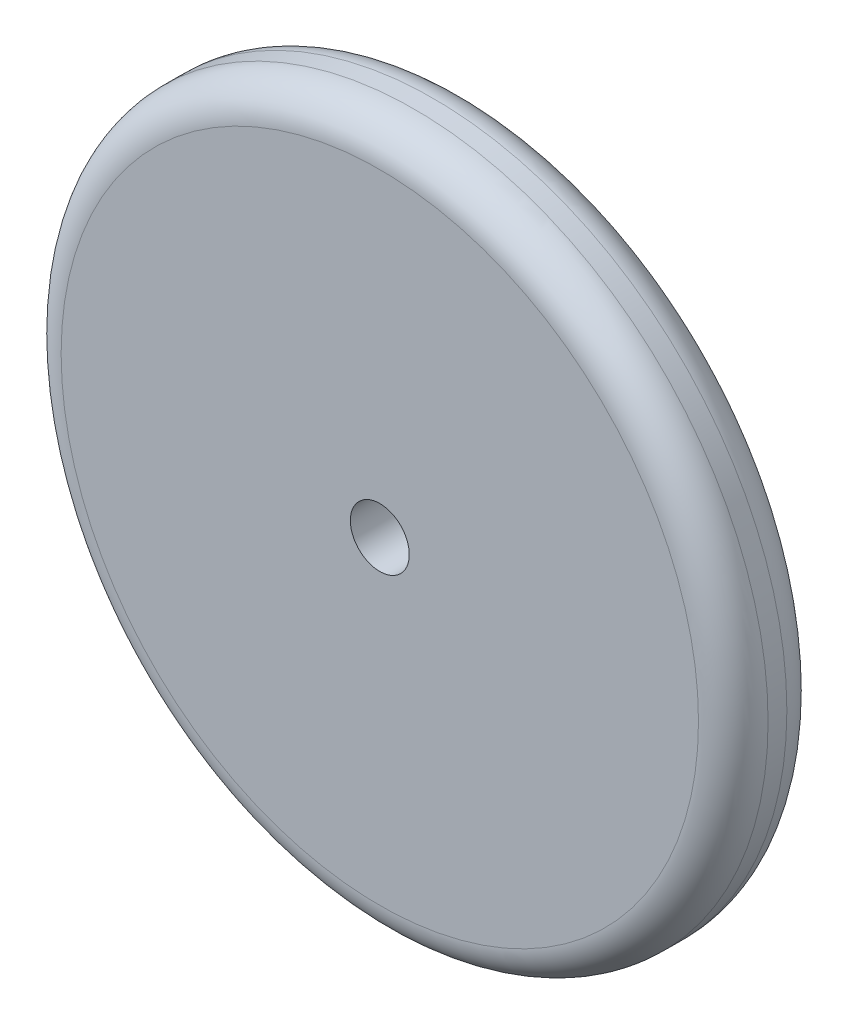
ISO-10303-21;
HEADER;
FILE_DESCRIPTION(('STEP AP214'),'2;1');
FILE_NAME('part.step','',(''),(''),'','','');
FILE_SCHEMA(('AUTOMOTIVE_DESIGN { 1 0 10303 214 1 1 1 1 }'));
ENDSEC;
DATA;
#1=APPLICATION_CONTEXT('core data for automotive mechanical design processes');
#2=APPLICATION_PROTOCOL_DEFINITION('international standard','automotive_design',2000,#1);
#3=PRODUCT_CONTEXT('',#1,'mechanical');
#4=PRODUCT('Part','Part','',(#3));
#5=PRODUCT_RELATED_PRODUCT_CATEGORY('part','',(#4));
#6=PRODUCT_DEFINITION_FORMATION('','',#4);
#7=PRODUCT_DEFINITION_CONTEXT('part definition',#1,'design');
#8=PRODUCT_DEFINITION('design','',#6,#7);
#9=PRODUCT_DEFINITION_SHAPE('','',#8);
#10=(LENGTH_UNIT() NAMED_UNIT(*) SI_UNIT(.MILLI.,.METRE.));
#11=(NAMED_UNIT(*) PLANE_ANGLE_UNIT() SI_UNIT($,.RADIAN.));
#12=(NAMED_UNIT(*) SI_UNIT($,.STERADIAN.) SOLID_ANGLE_UNIT());
#13=UNCERTAINTY_MEASURE_WITH_UNIT(LENGTH_MEASURE(1.E-05),#10,'distance_accuracy_value','');
#14=(GEOMETRIC_REPRESENTATION_CONTEXT(3) GLOBAL_UNCERTAINTY_ASSIGNED_CONTEXT((#13)) GLOBAL_UNIT_ASSIGNED_CONTEXT((#10,
#11,#12)) REPRESENTATION_CONTEXT('',''));
#15=CARTESIAN_POINT('',(0.,0.,0.));
#16=DIRECTION('',(0.,0.,1.));
#17=DIRECTION('',(1.,0.,0.));
#18=AXIS2_PLACEMENT_3D('',#15,#16,#17);
#19=CARTESIAN_POINT('',(0.,0.,38.1));
#20=DIRECTION('',(0.,0.,1.));
#21=DIRECTION('',(1.,0.,0.));
#22=AXIS2_PLACEMENT_3D('',#19,#20,#21);
#23=PLANE('',#22);
#24=CARTESIAN_POINT('',(0.,0.,38.1));
#25=DIRECTION('',(0.,0.,1.));
#26=DIRECTION('',(1.,0.,0.));
#27=AXIS2_PLACEMENT_3D('',#24,#25,#26);
#28=CIRCLE('',#27,137.4);
#29=CARTESIAN_POINT('',(137.4,0.,38.1));
#30=VERTEX_POINT('',#29);
#31=EDGE_CURVE('E10',#30,#30,#28,.T.);
#32=ORIENTED_EDGE('',*,*,#31,.T.);
#33=EDGE_LOOP('',(#32));
#34=FACE_BOUND('',#33,.T.);
#35=CARTESIAN_POINT('',(0.,0.,38.1));
#36=DIRECTION('',(0.,0.,1.));
#37=DIRECTION('',(1.,0.,0.));
#38=AXIS2_PLACEMENT_3D('',#35,#36,#37);
#39=CIRCLE('',#38,12.7);
#40=CARTESIAN_POINT('',(-12.7,0.,38.1));
#41=VERTEX_POINT('',#40);
#42=EDGE_CURVE('E56',#41,#41,#39,.T.);
#43=ORIENTED_EDGE('',*,*,#42,.F.);
#44=EDGE_LOOP('',(#43));
#45=FACE_BOUND('',#44,.T.);
#46=ADVANCED_FACE('F35',(#34,#45),#23,.T.);
#47=CARTESIAN_POINT('',(0.,0.,0.));
#48=DIRECTION('',(0.,0.,1.));
#49=DIRECTION('',(1.,0.,0.));
#50=AXIS2_PLACEMENT_3D('',#47,#48,#49);
#51=PLANE('',#50);
#52=CARTESIAN_POINT('',(0.,0.,0.));
#53=DIRECTION('',(0.,0.,1.));
#54=DIRECTION('',(1.,0.,0.));
#55=AXIS2_PLACEMENT_3D('',#52,#53,#54);
#56=CIRCLE('',#55,137.4);
#57=CARTESIAN_POINT('',(137.4,0.,0.));
#58=VERTEX_POINT('',#57);
#59=EDGE_CURVE('E42',#58,#58,#56,.F.);
#60=ORIENTED_EDGE('',*,*,#59,.T.);
#61=EDGE_LOOP('',(#60));
#62=FACE_BOUND('',#61,.T.);
#63=CARTESIAN_POINT('',(0.,0.,0.));
#64=DIRECTION('',(0.,0.,1.));
#65=DIRECTION('',(1.,0.,0.));
#66=AXIS2_PLACEMENT_3D('',#63,#64,#65);
#67=CIRCLE('',#66,12.7);
#68=CARTESIAN_POINT('',(-12.7,0.,0.));
#69=VERTEX_POINT('',#68);
#70=EDGE_CURVE('E57',#69,#69,#67,.T.);
#71=ORIENTED_EDGE('',*,*,#70,.T.);
#72=EDGE_LOOP('',(#71));
#73=FACE_BOUND('',#72,.T.);
#74=ADVANCED_FACE('F67',(#62,#73),#51,.F.);
#75=CARTESIAN_POINT('',(0.,0.,38.1));
#76=DIRECTION('',(0.,0.,-1.));
#77=DIRECTION('',(-1.,0.,0.));
#78=AXIS2_PLACEMENT_3D('',#75,#76,#77);
#79=CYLINDRICAL_SURFACE('',#78,152.4);
#80=CARTESIAN_POINT('',(0.,0.,15.));
#81=DIRECTION('',(0.,0.,1.));
#82=DIRECTION('',(1.,0.,0.));
#83=AXIS2_PLACEMENT_3D('',#80,#81,#82);
#84=CIRCLE('',#83,152.4);
#85=CARTESIAN_POINT('',(-152.4,0.,15.));
#86=VERTEX_POINT('',#85);
#87=EDGE_CURVE('E47',#86,#86,#84,.T.);
#88=CARTESIAN_POINT('',(0.,0.,23.1));
#89=DIRECTION('',(0.,0.,1.));
#90=DIRECTION('',(1.,0.,0.));
#91=AXIS2_PLACEMENT_3D('',#88,#89,#90);
#92=CIRCLE('',#91,152.4);
#93=CARTESIAN_POINT('',(-152.4,0.,23.1));
#94=VERTEX_POINT('',#93);
#95=EDGE_CURVE('E51',#94,#94,#92,.F.);
#96=CARTESIAN_POINT('',(-152.4,0.,15.));
#97=CARTESIAN_POINT('',(-152.4,0.,15.084375));
#98=CARTESIAN_POINT('',(-152.4,0.,15.16875));
#99=CARTESIAN_POINT('',(-152.4,0.,15.3375));
#100=CARTESIAN_POINT('',(-152.4,0.,15.421875));
#101=CARTESIAN_POINT('',(-152.4,0.,15.590625));
#102=CARTESIAN_POINT('',(-152.4,0.,15.675));
#103=CARTESIAN_POINT('',(-152.4,0.,15.84375));
#104=CARTESIAN_POINT('',(-152.4,0.,15.928125));
#105=CARTESIAN_POINT('',(-152.4,0.,16.096875));
#106=CARTESIAN_POINT('',(-152.4,0.,16.18125));
#107=CARTESIAN_POINT('',(-152.4,0.,16.35));
#108=CARTESIAN_POINT('',(-152.4,0.,16.434375));
#109=CARTESIAN_POINT('',(-152.4,0.,16.603125));
#110=CARTESIAN_POINT('',(-152.4,0.,16.6875));
#111=CARTESIAN_POINT('',(-152.4,0.,16.85625));
#112=CARTESIAN_POINT('',(-152.4,0.,16.940625));
#113=CARTESIAN_POINT('',(-152.4,0.,17.109375));
#114=CARTESIAN_POINT('',(-152.4,0.,17.19375));
#115=CARTESIAN_POINT('',(-152.4,0.,17.3625));
#116=CARTESIAN_POINT('',(-152.4,0.,17.446875));
#117=CARTESIAN_POINT('',(-152.4,0.,17.615625));
#118=CARTESIAN_POINT('',(-152.4,0.,17.7));
#119=CARTESIAN_POINT('',(-152.4,0.,17.86875));
#120=CARTESIAN_POINT('',(-152.4,0.,17.953125));
#121=CARTESIAN_POINT('',(-152.4,0.,18.121875));
#122=CARTESIAN_POINT('',(-152.4,0.,18.20625));
#123=CARTESIAN_POINT('',(-152.4,0.,18.375));
#124=CARTESIAN_POINT('',(-152.4,0.,18.459375));
#125=CARTESIAN_POINT('',(-152.4,0.,18.628125));
#126=CARTESIAN_POINT('',(-152.4,0.,18.7125));
#127=CARTESIAN_POINT('',(-152.4,0.,18.88125));
#128=CARTESIAN_POINT('',(-152.4,0.,18.965625));
#129=CARTESIAN_POINT('',(-152.4,0.,19.134375));
#130=CARTESIAN_POINT('',(-152.4,0.,19.21875));
#131=CARTESIAN_POINT('',(-152.4,0.,19.3875));
#132=CARTESIAN_POINT('',(-152.4,0.,19.471875));
#133=CARTESIAN_POINT('',(-152.4,0.,19.640625));
#134=CARTESIAN_POINT('',(-152.4,0.,19.725));
#135=CARTESIAN_POINT('',(-152.4,0.,19.89375));
#136=CARTESIAN_POINT('',(-152.4,0.,19.978125));
#137=CARTESIAN_POINT('',(-152.4,0.,20.146875));
#138=CARTESIAN_POINT('',(-152.4,0.,20.23125));
#139=CARTESIAN_POINT('',(-152.4,0.,20.4));
#140=CARTESIAN_POINT('',(-152.4,0.,20.484375));
#141=CARTESIAN_POINT('',(-152.4,0.,20.653125));
#142=CARTESIAN_POINT('',(-152.4,0.,20.7375));
#143=CARTESIAN_POINT('',(-152.4,0.,20.90625));
#144=CARTESIAN_POINT('',(-152.4,0.,20.990625));
#145=CARTESIAN_POINT('',(-152.4,0.,21.159375));
#146=CARTESIAN_POINT('',(-152.4,0.,21.24375));
#147=CARTESIAN_POINT('',(-152.4,0.,21.4125));
#148=CARTESIAN_POINT('',(-152.4,0.,21.496875));
#149=CARTESIAN_POINT('',(-152.4,0.,21.665625));
#150=CARTESIAN_POINT('',(-152.4,0.,21.75));
#151=CARTESIAN_POINT('',(-152.4,0.,21.91875));
#152=CARTESIAN_POINT('',(-152.4,0.,22.003125));
#153=CARTESIAN_POINT('',(-152.4,0.,22.171875));
#154=CARTESIAN_POINT('',(-152.4,0.,22.25625));
#155=CARTESIAN_POINT('',(-152.4,0.,22.425));
#156=CARTESIAN_POINT('',(-152.4,0.,22.509375));
#157=CARTESIAN_POINT('',(-152.4,0.,22.678125));
#158=CARTESIAN_POINT('',(-152.4,0.,22.7625));
#159=CARTESIAN_POINT('',(-152.4,0.,22.93125));
#160=CARTESIAN_POINT('',(-152.4,0.,23.015625));
#161=CARTESIAN_POINT('',(-152.4,0.,23.1));
#162=B_SPLINE_CURVE_WITH_KNOTS('',3,(#96,#97,#98,#99,#100,#101,#102,#103,#104,#105,#106,#107,
#108,#109,#110,#111,#112,#113,#114,#115,#116,#117,#118,#119,#120,#121,#122,#123,#124,#125,#126,
#127,#128,#129,#130,#131,#132,#133,#134,#135,#136,#137,#138,#139,#140,#141,#142,#143,#144,#145,
#146,#147,#148,#149,#150,#151,#152,#153,#154,#155,#156,#157,#158,#159,#160,#161),.UNSPECIFIED.,
.F.,.F.,(4,2,2,2,2,2,2,2,2,2,2,2,2,2,2,2,2,2,2,2,2,2,2,2,2,2,2,2,2,2,2,2,4),(0.,0.253125,
0.50625,0.759375,1.0125,1.265625,1.51875,1.771875,2.025,2.278125,2.53125,2.784375,3.0375,
3.290625,3.54375,3.796875,4.05000000000001,4.303125,4.55625,4.809375,5.0625,5.315625,5.56875,
5.821875,6.075,6.328125,6.58125,6.834375,7.0875,7.34062500000001,7.59375000000001,
7.84687500000001,8.10000000000001),.UNSPECIFIED.);
#163=EDGE_CURVE('BSEAM72',#86,#94,#162,.T.);
#164=ORIENTED_EDGE('',*,*,#87,.T.);
#165=ORIENTED_EDGE('',*,*,#95,.T.);
#166=ORIENTED_EDGE('',*,*,#163,.T.);
#167=ORIENTED_EDGE('',*,*,#163,.F.);
#168=EDGE_LOOP('',(#164,#166,#165,#167));
#169=FACE_BOUND('',#168,.T.);
#170=ADVANCED_FACE('F72',(#169),#79,.T.);
#171=CARTESIAN_POINT('',(0.,0.,38.1));
#172=DIRECTION('',(0.,0.,-1.));
#173=DIRECTION('',(-1.,0.,0.));
#174=AXIS2_PLACEMENT_3D('',#171,#172,#173);
#175=CYLINDRICAL_SURFACE('',#174,12.7);
#176=CARTESIAN_POINT('',(-12.7,0.,38.1));
#177=CARTESIAN_POINT('',(-12.7,0.,37.703125));
#178=CARTESIAN_POINT('',(-12.7,0.,37.30625));
#179=CARTESIAN_POINT('',(-12.7,0.,36.5125));
#180=CARTESIAN_POINT('',(-12.7,0.,36.115625));
#181=CARTESIAN_POINT('',(-12.7,0.,35.321875));
#182=CARTESIAN_POINT('',(-12.7,0.,34.925));
#183=CARTESIAN_POINT('',(-12.7,0.,34.13125));
#184=CARTESIAN_POINT('',(-12.7,0.,33.734375));
#185=CARTESIAN_POINT('',(-12.7,0.,32.940625));
#186=CARTESIAN_POINT('',(-12.7,0.,32.54375));
#187=CARTESIAN_POINT('',(-12.7,0.,31.75));
#188=CARTESIAN_POINT('',(-12.7,0.,31.353125));
#189=CARTESIAN_POINT('',(-12.7,0.,30.559375));
#190=CARTESIAN_POINT('',(-12.7,0.,30.1625));
#191=CARTESIAN_POINT('',(-12.7,0.,29.36875));
#192=CARTESIAN_POINT('',(-12.7,0.,28.971875));
#193=CARTESIAN_POINT('',(-12.7,0.,28.178125));
#194=CARTESIAN_POINT('',(-12.7,0.,27.78125));
#195=CARTESIAN_POINT('',(-12.7,0.,26.9875));
#196=CARTESIAN_POINT('',(-12.7,0.,26.590625));
#197=CARTESIAN_POINT('',(-12.7,0.,25.796875));
#198=CARTESIAN_POINT('',(-12.7,0.,25.4));
#199=CARTESIAN_POINT('',(-12.7,0.,24.60625));
#200=CARTESIAN_POINT('',(-12.7,0.,24.209375));
#201=CARTESIAN_POINT('',(-12.7,0.,23.415625));
#202=CARTESIAN_POINT('',(-12.7,0.,23.01875));
#203=CARTESIAN_POINT('',(-12.7,0.,22.225));
#204=CARTESIAN_POINT('',(-12.7,0.,21.828125));
#205=CARTESIAN_POINT('',(-12.7,0.,21.034375));
#206=CARTESIAN_POINT('',(-12.7,0.,20.6375));
#207=CARTESIAN_POINT('',(-12.7,0.,19.84375));
#208=CARTESIAN_POINT('',(-12.7,0.,19.446875));
#209=CARTESIAN_POINT('',(-12.7,0.,18.653125));
#210=CARTESIAN_POINT('',(-12.7,0.,18.25625));
#211=CARTESIAN_POINT('',(-12.7,0.,17.4625));
#212=CARTESIAN_POINT('',(-12.7,0.,17.065625));
#213=CARTESIAN_POINT('',(-12.7,0.,16.271875));
#214=CARTESIAN_POINT('',(-12.7,0.,15.875));
#215=CARTESIAN_POINT('',(-12.7,0.,15.08125));
#216=CARTESIAN_POINT('',(-12.7,0.,14.684375));
#217=CARTESIAN_POINT('',(-12.7,0.,13.890625));
#218=CARTESIAN_POINT('',(-12.7,0.,13.49375));
#219=CARTESIAN_POINT('',(-12.7,0.,12.7));
#220=CARTESIAN_POINT('',(-12.7,0.,12.303125));
#221=CARTESIAN_POINT('',(-12.7,0.,11.509375));
#222=CARTESIAN_POINT('',(-12.7,0.,11.1125));
#223=CARTESIAN_POINT('',(-12.7,0.,10.31875));
#224=CARTESIAN_POINT('',(-12.7,0.,9.92187499999999));
#225=CARTESIAN_POINT('',(-12.7,0.,9.128125));
#226=CARTESIAN_POINT('',(-12.7,0.,8.73124999999999));
#227=CARTESIAN_POINT('',(-12.7,0.,7.93749999999999));
#228=CARTESIAN_POINT('',(-12.7,0.,7.54062499999999));
#229=CARTESIAN_POINT('',(-12.7,0.,6.746875));
#230=CARTESIAN_POINT('',(-12.7,0.,6.35));
#231=CARTESIAN_POINT('',(-12.7,0.,5.55625));
#232=CARTESIAN_POINT('',(-12.7,0.,5.159375));
#233=CARTESIAN_POINT('',(-12.7,0.,4.365625));
#234=CARTESIAN_POINT('',(-12.7,0.,3.96875));
#235=CARTESIAN_POINT('',(-12.7,0.,3.175));
#236=CARTESIAN_POINT('',(-12.7,0.,2.778125));
#237=CARTESIAN_POINT('',(-12.7,0.,1.984375));
#238=CARTESIAN_POINT('',(-12.7,0.,1.5875));
#239=CARTESIAN_POINT('',(-12.7,0.,0.79375));
#240=CARTESIAN_POINT('',(-12.7,0.,0.396875));
#241=CARTESIAN_POINT('',(-12.7,0.,0.));
#242=B_SPLINE_CURVE_WITH_KNOTS('',3,(#176,#177,#178,#179,#180,#181,#182,#183,#184,#185,#186,
#187,#188,#189,#190,#191,#192,#193,#194,#195,#196,#197,#198,#199,#200,#201,#202,#203,#204,#205,
#206,#207,#208,#209,#210,#211,#212,#213,#214,#215,#216,#217,#218,#219,#220,#221,#222,#223,#224,
#225,#226,#227,#228,#229,#230,#231,#232,#233,#234,#235,#236,#237,#238,#239,#240,#241),
.UNSPECIFIED.,.F.,.F.,(4,2,2,2,2,2,2,2,2,2,2,2,2,2,2,2,2,2,2,2,2,2,2,2,2,2,2,2,2,2,2,2,4),(0.,
1.190625,2.38125,3.571875,4.7625,5.953125,7.14375,8.334375,9.52500000000001,10.715625,11.90625,
13.096875,14.2875,15.478125,16.66875,17.859375,19.05,20.240625,21.43125,22.621875,23.8125,
25.003125,26.19375,27.384375,28.575,29.765625,30.95625,32.146875,33.3375,34.528125,35.71875,
36.909375,38.1),.UNSPECIFIED.);
#243=EDGE_CURVE('BSEAM63',#41,#69,#242,.T.);
#244=ORIENTED_EDGE('',*,*,#42,.T.);
#245=ORIENTED_EDGE('',*,*,#70,.F.);
#246=ORIENTED_EDGE('',*,*,#243,.T.);
#247=ORIENTED_EDGE('',*,*,#243,.F.);
#248=EDGE_LOOP('',(#244,#246,#245,#247));
#249=FACE_BOUND('',#248,.T.);
#250=ADVANCED_FACE('F63',(#249),#175,.F.);
#251=CARTESIAN_POINT('',(0.,0.,15.));
#252=DIRECTION('',(0.,0.,1.));
#253=DIRECTION('',(1.,0.,0.));
#254=AXIS2_PLACEMENT_3D('',#251,#252,#253);
#255=TOROIDAL_SURFACE('',#254,137.4,15.);
#256=ORIENTED_EDGE('',*,*,#59,.F.);
#257=EDGE_LOOP('',(#256));
#258=FACE_BOUND('',#257,.T.);
#259=ORIENTED_EDGE('',*,*,#87,.F.);
#260=EDGE_LOOP('',(#259));
#261=FACE_BOUND('',#260,.T.);
#262=ADVANCED_FACE('F78',(#258,#261),#255,.T.);
#263=CARTESIAN_POINT('',(0.,0.,23.1));
#264=DIRECTION('',(0.,0.,1.));
#265=DIRECTION('',(1.,0.,0.));
#266=AXIS2_PLACEMENT_3D('',#263,#264,#265);
#267=TOROIDAL_SURFACE('',#266,137.4,15.);
#268=ORIENTED_EDGE('',*,*,#95,.F.);
#269=EDGE_LOOP('',(#268));
#270=FACE_BOUND('',#269,.T.);
#271=ORIENTED_EDGE('',*,*,#31,.F.);
#272=EDGE_LOOP('',(#271));
#273=FACE_BOUND('',#272,.T.);
#274=ADVANCED_FACE('F37',(#270,#273),#267,.T.);
#275=CLOSED_SHELL('',(#46,#74,#170,#250,#262,#274));
#276=MANIFOLD_SOLID_BREP('B2',#275);
#277=ADVANCED_BREP_SHAPE_REPRESENTATION('',(#18,#276),#14);
#278=SHAPE_DEFINITION_REPRESENTATION(#9,#277);
ENDSEC;
END-ISO-10303-21;
